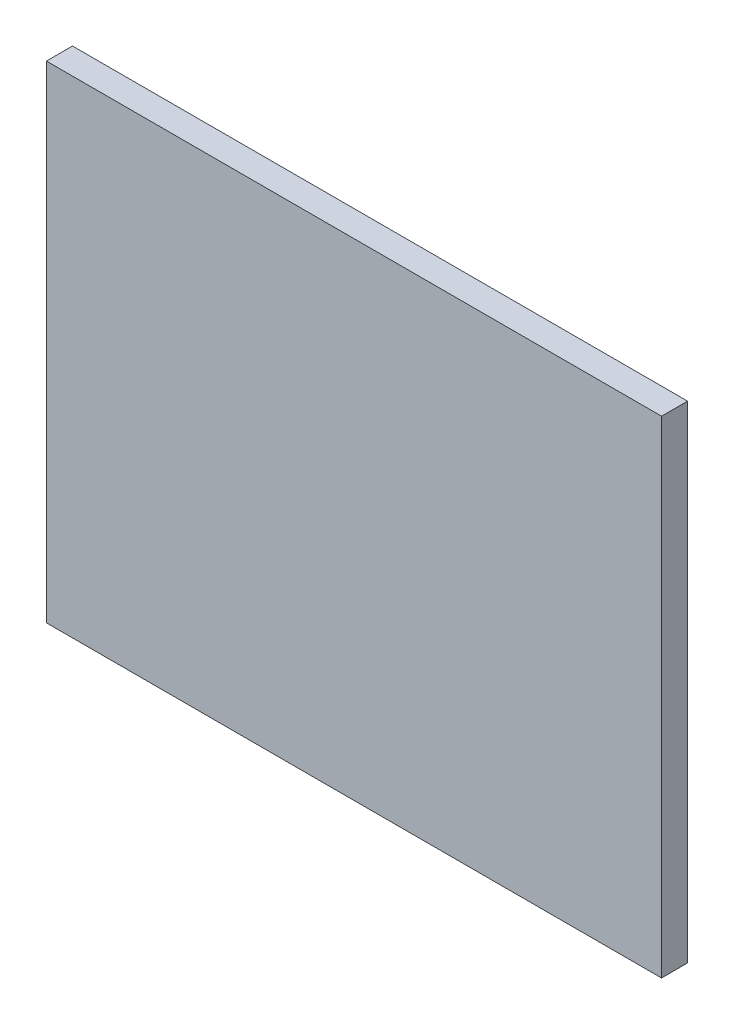
ISO-10303-21;
HEADER;
FILE_DESCRIPTION(('STEP AP214'),'2;1');
FILE_NAME('part.step','',(''),(''),'','','');
FILE_SCHEMA(('AUTOMOTIVE_DESIGN { 1 0 10303 214 1 1 1 1 }'));
ENDSEC;
DATA;
#1=APPLICATION_CONTEXT('core data for automotive mechanical design processes');
#2=APPLICATION_PROTOCOL_DEFINITION('international standard','automotive_design',2000,#1);
#3=PRODUCT_CONTEXT('',#1,'mechanical');
#4=PRODUCT('Part','Part','',(#3));
#5=PRODUCT_RELATED_PRODUCT_CATEGORY('part','',(#4));
#6=PRODUCT_DEFINITION_FORMATION('','',#4);
#7=PRODUCT_DEFINITION_CONTEXT('part definition',#1,'design');
#8=PRODUCT_DEFINITION('design','',#6,#7);
#9=PRODUCT_DEFINITION_SHAPE('','',#8);
#10=(LENGTH_UNIT() NAMED_UNIT(*) SI_UNIT(.MILLI.,.METRE.));
#11=(NAMED_UNIT(*) PLANE_ANGLE_UNIT() SI_UNIT($,.RADIAN.));
#12=(NAMED_UNIT(*) SI_UNIT($,.STERADIAN.) SOLID_ANGLE_UNIT());
#13=UNCERTAINTY_MEASURE_WITH_UNIT(LENGTH_MEASURE(1.E-05),#10,'distance_accuracy_value','');
#14=(GEOMETRIC_REPRESENTATION_CONTEXT(3) GLOBAL_UNCERTAINTY_ASSIGNED_CONTEXT((#13)) GLOBAL_UNIT_ASSIGNED_CONTEXT((#10,
#11,#12)) REPRESENTATION_CONTEXT('',''));
#15=CARTESIAN_POINT('',(0.,0.,0.));
#16=DIRECTION('',(0.,0.,1.));
#17=DIRECTION('',(1.,0.,0.));
#18=AXIS2_PLACEMENT_3D('',#15,#16,#17);
#19=CARTESIAN_POINT('',(0.,0.,15.));
#20=DIRECTION('',(1.,0.,0.));
#21=DIRECTION('',(0.,0.,-1.));
#22=AXIS2_PLACEMENT_3D('',#19,#20,#21);
#23=PLANE('',#22);
#24=DIRECTION('',(0.,-1.,0.));
#25=VECTOR('',#24,1.);
#26=CARTESIAN_POINT('',(0.,0.,0.));
#27=LINE('',#26,#25);
#28=CARTESIAN_POINT('',(0.,280.,0.));
#29=VERTEX_POINT('',#28);
#30=CARTESIAN_POINT('',(0.,0.,0.));
#31=VERTEX_POINT('',#30);
#32=EDGE_CURVE('E96',#29,#31,#27,.T.);
#33=ORIENTED_EDGE('',*,*,#32,.T.);
#34=DIRECTION('',(0.,0.,-1.));
#35=VECTOR('',#34,1.);
#36=CARTESIAN_POINT('',(0.,0.,15.));
#37=LINE('',#36,#35);
#38=CARTESIAN_POINT('',(0.,0.,15.));
#39=VERTEX_POINT('',#38);
#40=EDGE_CURVE('E11',#39,#31,#37,.T.);
#41=ORIENTED_EDGE('',*,*,#40,.F.);
#42=DIRECTION('',(0.,-1.,0.));
#43=VECTOR('',#42,1.);
#44=CARTESIAN_POINT('',(0.,0.,15.));
#45=LINE('',#44,#43);
#46=CARTESIAN_POINT('',(0.,280.,15.));
#47=VERTEX_POINT('',#46);
#48=EDGE_CURVE('E84',#47,#39,#45,.T.);
#49=ORIENTED_EDGE('',*,*,#48,.F.);
#50=DIRECTION('',(0.,0.,-1.));
#51=VECTOR('',#50,1.);
#52=CARTESIAN_POINT('',(0.,280.,15.));
#53=LINE('',#52,#51);
#54=EDGE_CURVE('E92',#47,#29,#53,.T.);
#55=ORIENTED_EDGE('',*,*,#54,.T.);
#56=EDGE_LOOP('',(#33,#41,#49,#55));
#57=FACE_BOUND('',#56,.T.);
#58=ADVANCED_FACE('F33',(#57),#23,.F.);
#59=CARTESIAN_POINT('',(0.,0.,15.));
#60=DIRECTION('',(0.,1.,0.));
#61=DIRECTION('',(0.,0.,1.));
#62=AXIS2_PLACEMENT_3D('',#59,#60,#61);
#63=PLANE('',#62);
#64=DIRECTION('',(1.,0.,0.));
#65=VECTOR('',#64,1.);
#66=CARTESIAN_POINT('',(0.,0.,0.));
#67=LINE('',#66,#65);
#68=CARTESIAN_POINT('',(354.,0.,0.));
#69=VERTEX_POINT('',#68);
#70=EDGE_CURVE('E88',#31,#69,#67,.T.);
#71=ORIENTED_EDGE('',*,*,#70,.T.);
#72=DIRECTION('',(0.,0.,-1.));
#73=VECTOR('',#72,1.);
#74=CARTESIAN_POINT('',(354.,0.,15.));
#75=LINE('',#74,#73);
#76=CARTESIAN_POINT('',(354.,0.,15.));
#77=VERTEX_POINT('',#76);
#78=EDGE_CURVE('E41',#77,#69,#75,.T.);
#79=ORIENTED_EDGE('',*,*,#78,.F.);
#80=DIRECTION('',(1.,0.,0.));
#81=VECTOR('',#80,1.);
#82=CARTESIAN_POINT('',(0.,0.,15.));
#83=LINE('',#82,#81);
#84=EDGE_CURVE('E79',#39,#77,#83,.T.);
#85=ORIENTED_EDGE('',*,*,#84,.F.);
#86=ORIENTED_EDGE('',*,*,#40,.T.);
#87=EDGE_LOOP('',(#71,#79,#85,#86));
#88=FACE_BOUND('',#87,.T.);
#89=ADVANCED_FACE('F87',(#88),#63,.F.);
#90=CARTESIAN_POINT('',(354.,0.,15.));
#91=DIRECTION('',(-1.,0.,0.));
#92=DIRECTION('',(0.,0.,1.));
#93=AXIS2_PLACEMENT_3D('',#90,#91,#92);
#94=PLANE('',#93);
#95=DIRECTION('',(0.,1.,0.));
#96=VECTOR('',#95,1.);
#97=CARTESIAN_POINT('',(354.,0.,0.));
#98=LINE('',#97,#96);
#99=CARTESIAN_POINT('',(354.,280.,0.));
#100=VERTEX_POINT('',#99);
#101=EDGE_CURVE('E66',#69,#100,#98,.T.);
#102=ORIENTED_EDGE('',*,*,#101,.T.);
#103=DIRECTION('',(0.,0.,-1.));
#104=VECTOR('',#103,1.);
#105=CARTESIAN_POINT('',(354.,280.,15.));
#106=LINE('',#105,#104);
#107=CARTESIAN_POINT('',(354.,280.,15.));
#108=VERTEX_POINT('',#107);
#109=EDGE_CURVE('E89',#108,#100,#106,.T.);
#110=ORIENTED_EDGE('',*,*,#109,.F.);
#111=DIRECTION('',(0.,1.,0.));
#112=VECTOR('',#111,1.);
#113=CARTESIAN_POINT('',(354.,0.,15.));
#114=LINE('',#113,#112);
#115=EDGE_CURVE('E82',#77,#108,#114,.T.);
#116=ORIENTED_EDGE('',*,*,#115,.F.);
#117=ORIENTED_EDGE('',*,*,#78,.T.);
#118=EDGE_LOOP('',(#102,#110,#116,#117));
#119=FACE_BOUND('',#118,.T.);
#120=ADVANCED_FACE('F90',(#119),#94,.F.);
#121=CARTESIAN_POINT('',(0.,280.,15.));
#122=DIRECTION('',(0.,-1.,0.));
#123=DIRECTION('',(0.,0.,-1.));
#124=AXIS2_PLACEMENT_3D('',#121,#122,#123);
#125=PLANE('',#124);
#126=DIRECTION('',(-1.,0.,0.));
#127=VECTOR('',#126,1.);
#128=CARTESIAN_POINT('',(0.,280.,0.));
#129=LINE('',#128,#127);
#130=EDGE_CURVE('E72',#100,#29,#129,.T.);
#131=ORIENTED_EDGE('',*,*,#130,.T.);
#132=ORIENTED_EDGE('',*,*,#54,.F.);
#133=DIRECTION('',(-1.,0.,0.));
#134=VECTOR('',#133,1.);
#135=CARTESIAN_POINT('',(0.,280.,15.));
#136=LINE('',#135,#134);
#137=EDGE_CURVE('E49',#108,#47,#136,.T.);
#138=ORIENTED_EDGE('',*,*,#137,.F.);
#139=ORIENTED_EDGE('',*,*,#109,.T.);
#140=EDGE_LOOP('',(#131,#132,#138,#139));
#141=FACE_BOUND('',#140,.T.);
#142=ADVANCED_FACE('F103',(#141),#125,.F.);
#143=CARTESIAN_POINT('',(0.,0.,15.));
#144=DIRECTION('',(0.,0.,-1.));
#145=DIRECTION('',(-1.,0.,0.));
#146=AXIS2_PLACEMENT_3D('',#143,#144,#145);
#147=PLANE('',#146);
#148=ORIENTED_EDGE('',*,*,#48,.T.);
#149=ORIENTED_EDGE('',*,*,#84,.T.);
#150=ORIENTED_EDGE('',*,*,#115,.T.);
#151=ORIENTED_EDGE('',*,*,#137,.T.);
#152=EDGE_LOOP('',(#148,#149,#150,#151));
#153=FACE_BOUND('',#152,.T.);
#154=ADVANCED_FACE('F80',(#153),#147,.F.);
#155=CARTESIAN_POINT('',(0.,0.,0.));
#156=DIRECTION('',(0.,0.,-1.));
#157=DIRECTION('',(-1.,0.,0.));
#158=AXIS2_PLACEMENT_3D('',#155,#156,#157);
#159=PLANE('',#158);
#160=ORIENTED_EDGE('',*,*,#32,.F.);
#161=ORIENTED_EDGE('',*,*,#130,.F.);
#162=ORIENTED_EDGE('',*,*,#101,.F.);
#163=ORIENTED_EDGE('',*,*,#70,.F.);
#164=EDGE_LOOP('',(#160,#161,#162,#163));
#165=FACE_BOUND('',#164,.T.);
#166=ADVANCED_FACE('F106',(#165),#159,.T.);
#167=CLOSED_SHELL('',(#58,#89,#120,#142,#154,#166));
#168=MANIFOLD_SOLID_BREP('B2',#167);
#169=ADVANCED_BREP_SHAPE_REPRESENTATION('',(#18,#168),#14);
#170=SHAPE_DEFINITION_REPRESENTATION(#9,#169);
ENDSEC;
END-ISO-10303-21;
